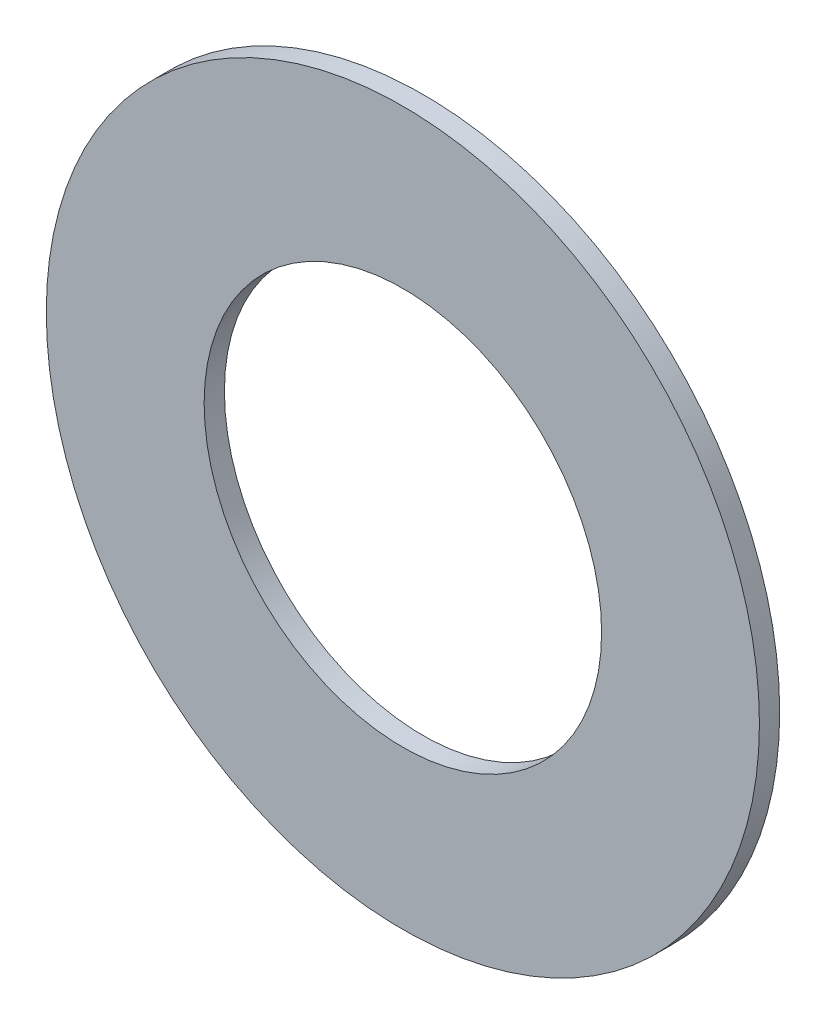
ISO-10303-21;
HEADER;
FILE_DESCRIPTION(('STEP AP214'),'2;1');
FILE_NAME('part.step','',(''),(''),'','','');
FILE_SCHEMA(('AUTOMOTIVE_DESIGN { 1 0 10303 214 1 1 1 1 }'));
ENDSEC;
DATA;
#1=APPLICATION_CONTEXT('core data for automotive mechanical design processes');
#2=APPLICATION_PROTOCOL_DEFINITION('international standard','automotive_design',2000,#1);
#3=PRODUCT_CONTEXT('',#1,'mechanical');
#4=PRODUCT('Part','Part','',(#3));
#5=PRODUCT_RELATED_PRODUCT_CATEGORY('part','',(#4));
#6=PRODUCT_DEFINITION_FORMATION('','',#4);
#7=PRODUCT_DEFINITION_CONTEXT('part definition',#1,'design');
#8=PRODUCT_DEFINITION('design','',#6,#7);
#9=PRODUCT_DEFINITION_SHAPE('','',#8);
#10=(LENGTH_UNIT() NAMED_UNIT(*) SI_UNIT(.MILLI.,.METRE.));
#11=(NAMED_UNIT(*) PLANE_ANGLE_UNIT() SI_UNIT($,.RADIAN.));
#12=(NAMED_UNIT(*) SI_UNIT($,.STERADIAN.) SOLID_ANGLE_UNIT());
#13=UNCERTAINTY_MEASURE_WITH_UNIT(LENGTH_MEASURE(1.E-05),#10,'distance_accuracy_value','');
#14=(GEOMETRIC_REPRESENTATION_CONTEXT(3) GLOBAL_UNCERTAINTY_ASSIGNED_CONTEXT((#13)) GLOBAL_UNIT_ASSIGNED_CONTEXT((#10,
#11,#12)) REPRESENTATION_CONTEXT('',''));
#15=CARTESIAN_POINT('',(0.,0.,0.));
#16=DIRECTION('',(0.,0.,1.));
#17=DIRECTION('',(1.,0.,0.));
#18=AXIS2_PLACEMENT_3D('',#15,#16,#17);
#19=CARTESIAN_POINT('',(0.,0.,-0.406399999999997));
#20=DIRECTION('',(0.,0.,1.));
#21=DIRECTION('',(1.,0.,0.));
#22=AXIS2_PLACEMENT_3D('',#19,#20,#21);
#23=CYLINDRICAL_SURFACE('',#22,14.2875);
#24=CARTESIAN_POINT('',(0.,0.,-0.406399999999997));
#25=DIRECTION('',(0.,0.,1.));
#26=DIRECTION('',(1.,0.,0.));
#27=AXIS2_PLACEMENT_3D('',#24,#25,#26);
#28=CIRCLE('',#27,14.2875);
#29=CARTESIAN_POINT('',(14.2875,0.,-0.406399999999997));
#30=VERTEX_POINT('',#29);
#31=EDGE_CURVE('E10',#30,#30,#28,.T.);
#32=ORIENTED_EDGE('',*,*,#31,.T.);
#33=EDGE_LOOP('',(#32));
#34=FACE_BOUND('',#33,.T.);
#35=CARTESIAN_POINT('',(0.,0.,0.406400000000003));
#36=DIRECTION('',(0.,0.,1.));
#37=DIRECTION('',(1.,0.,0.));
#38=AXIS2_PLACEMENT_3D('',#35,#36,#37);
#39=CIRCLE('',#38,14.2875);
#40=CARTESIAN_POINT('',(14.2875,0.,0.406400000000003));
#41=VERTEX_POINT('',#40);
#42=EDGE_CURVE('E46',#41,#41,#39,.T.);
#43=ORIENTED_EDGE('',*,*,#42,.F.);
#44=EDGE_LOOP('',(#43));
#45=FACE_BOUND('',#44,.T.);
#46=ADVANCED_FACE('F36',(#34,#45),#23,.T.);
#47=CARTESIAN_POINT('',(0.,0.,-0.406399999999997));
#48=DIRECTION('',(0.,0.,1.));
#49=DIRECTION('',(1.,0.,0.));
#50=AXIS2_PLACEMENT_3D('',#47,#48,#49);
#51=PLANE('',#50);
#52=CARTESIAN_POINT('',(0.,0.,-0.406399999999997));
#53=DIRECTION('',(0.,0.,1.));
#54=DIRECTION('',(1.,0.,0.));
#55=AXIS2_PLACEMENT_3D('',#52,#53,#54);
#56=CIRCLE('',#55,7.9629);
#57=CARTESIAN_POINT('',(7.9629,0.,-0.406399999999997));
#58=VERTEX_POINT('',#57);
#59=EDGE_CURVE('E42',#58,#58,#56,.T.);
#60=ORIENTED_EDGE('',*,*,#59,.T.);
#61=EDGE_LOOP('',(#60));
#62=FACE_BOUND('',#61,.T.);
#63=ORIENTED_EDGE('',*,*,#31,.F.);
#64=EDGE_LOOP('',(#63));
#65=FACE_BOUND('',#64,.T.);
#66=ADVANCED_FACE('F65',(#62,#65),#51,.F.);
#67=CARTESIAN_POINT('',(0.,0.,-0.406399999999997));
#68=DIRECTION('',(0.,0.,1.));
#69=DIRECTION('',(1.,0.,0.));
#70=AXIS2_PLACEMENT_3D('',#67,#68,#69);
#71=CYLINDRICAL_SURFACE('',#70,7.9629);
#72=ORIENTED_EDGE('',*,*,#59,.F.);
#73=EDGE_LOOP('',(#72));
#74=FACE_BOUND('',#73,.T.);
#75=CARTESIAN_POINT('',(0.,0.,0.406400000000003));
#76=DIRECTION('',(0.,0.,1.));
#77=DIRECTION('',(1.,0.,0.));
#78=AXIS2_PLACEMENT_3D('',#75,#76,#77);
#79=CIRCLE('',#78,7.9629);
#80=CARTESIAN_POINT('',(7.9629,0.,0.406400000000003));
#81=VERTEX_POINT('',#80);
#82=EDGE_CURVE('E50',#81,#81,#79,.T.);
#83=ORIENTED_EDGE('',*,*,#82,.T.);
#84=EDGE_LOOP('',(#83));
#85=FACE_BOUND('',#84,.T.);
#86=ADVANCED_FACE('F56',(#74,#85),#71,.F.);
#87=CARTESIAN_POINT('',(0.,0.,0.406400000000003));
#88=DIRECTION('',(0.,0.,1.));
#89=DIRECTION('',(1.,0.,0.));
#90=AXIS2_PLACEMENT_3D('',#87,#88,#89);
#91=PLANE('',#90);
#92=ORIENTED_EDGE('',*,*,#42,.T.);
#93=EDGE_LOOP('',(#92));
#94=FACE_BOUND('',#93,.T.);
#95=ORIENTED_EDGE('',*,*,#82,.F.);
#96=EDGE_LOOP('',(#95));
#97=FACE_BOUND('',#96,.T.);
#98=ADVANCED_FACE('F58',(#94,#97),#91,.T.);
#99=CLOSED_SHELL('',(#46,#66,#86,#98));
#100=MANIFOLD_SOLID_BREP('B2',#99);
#101=ADVANCED_BREP_SHAPE_REPRESENTATION('',(#18,#100),#14);
#102=SHAPE_DEFINITION_REPRESENTATION(#9,#101);
ENDSEC;
END-ISO-10303-21;
